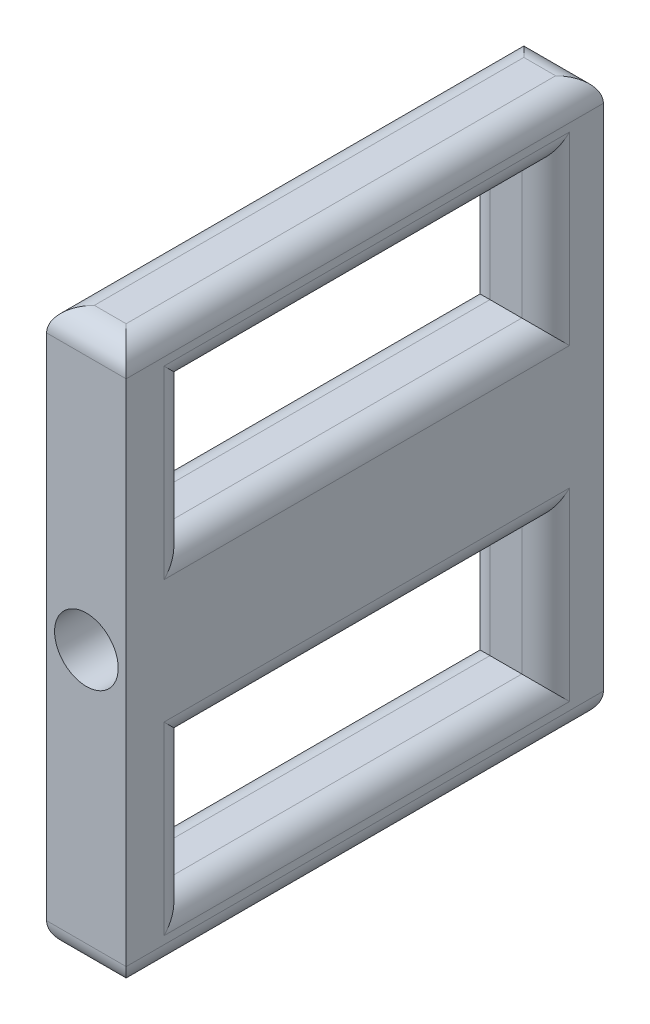
ISO-10303-21;
HEADER;
FILE_DESCRIPTION(('STEP AP214'),'2;1');
FILE_NAME('part.step','',(''),(''),'','','');
FILE_SCHEMA(('AUTOMOTIVE_DESIGN { 1 0 10303 214 1 1 1 1 }'));
ENDSEC;
DATA;
#1=APPLICATION_CONTEXT('core data for automotive mechanical design processes');
#2=APPLICATION_PROTOCOL_DEFINITION('international standard','automotive_design',2000,#1);
#3=PRODUCT_CONTEXT('',#1,'mechanical');
#4=PRODUCT('Part','Part','',(#3));
#5=PRODUCT_RELATED_PRODUCT_CATEGORY('part','',(#4));
#6=PRODUCT_DEFINITION_FORMATION('','',#4);
#7=PRODUCT_DEFINITION_CONTEXT('part definition',#1,'design');
#8=PRODUCT_DEFINITION('design','',#6,#7);
#9=PRODUCT_DEFINITION_SHAPE('','',#8);
#10=(LENGTH_UNIT() NAMED_UNIT(*) SI_UNIT(.MILLI.,.METRE.));
#11=(NAMED_UNIT(*) PLANE_ANGLE_UNIT() SI_UNIT($,.RADIAN.));
#12=(NAMED_UNIT(*) SI_UNIT($,.STERADIAN.) SOLID_ANGLE_UNIT());
#13=UNCERTAINTY_MEASURE_WITH_UNIT(LENGTH_MEASURE(1.E-05),#10,'distance_accuracy_value','');
#14=(GEOMETRIC_REPRESENTATION_CONTEXT(3) GLOBAL_UNCERTAINTY_ASSIGNED_CONTEXT((#13)) GLOBAL_UNIT_ASSIGNED_CONTEXT((#10,
#11,#12)) REPRESENTATION_CONTEXT('',''));
#15=CARTESIAN_POINT('',(0.,0.,0.));
#16=DIRECTION('',(0.,0.,1.));
#17=DIRECTION('',(1.,0.,0.));
#18=AXIS2_PLACEMENT_3D('',#15,#16,#17);
#19=CARTESIAN_POINT('',(0.,25.4568300567052,60.));
#20=DIRECTION('',(1.,0.,0.));
#21=DIRECTION('',(0.,1.,0.));
#22=AXIS2_PLACEMENT_3D('',#19,#20,#21);
#23=PLANE('',#22);
#24=DIRECTION('',(0.,1.,0.));
#25=VECTOR('',#24,1.);
#26=CARTESIAN_POINT('',(0.,-37.5539282314345,55.2500473128589));
#27=LINE('',#26,#25);
#28=CARTESIAN_POINT('',(0.,-17.2945836921086,55.2500473128589));
#29=VERTEX_POINT('',#28);
#30=CARTESIAN_POINT('',(0.,-40.5539282314345,55.2500473128589));
#31=VERTEX_POINT('',#30);
#32=EDGE_CURVE('E378',#29,#31,#27,.F.);
#33=ORIENTED_EDGE('',*,*,#32,.T.);
#34=DIRECTION('',(0.,0.,-1.));
#35=VECTOR('',#34,1.);
#36=CARTESIAN_POINT('',(0.,-40.5539282314345,60.));
#37=LINE('',#36,#35);
#38=CARTESIAN_POINT('',(0.,-40.5539282314345,4.25773889837708));
#39=VERTEX_POINT('',#38);
#40=EDGE_CURVE('E371',#31,#39,#37,.T.);
#41=ORIENTED_EDGE('',*,*,#40,.T.);
#42=DIRECTION('',(0.,1.,0.));
#43=VECTOR('',#42,1.);
#44=CARTESIAN_POINT('',(0.,25.4568300567052,4.25773889837708));
#45=LINE('',#44,#43);
#46=CARTESIAN_POINT('',(0.,-17.2945836921086,4.25773889837708));
#47=VERTEX_POINT('',#46);
#48=EDGE_CURVE('E374',#39,#47,#45,.T.);
#49=ORIENTED_EDGE('',*,*,#48,.T.);
#50=DIRECTION('',(0.,0.,-1.));
#51=VECTOR('',#50,1.);
#52=CARTESIAN_POINT('',(0.,-17.2945836921086,52.2500473128589));
#53=LINE('',#52,#51);
#54=EDGE_CURVE('E376',#47,#29,#53,.F.);
#55=ORIENTED_EDGE('',*,*,#54,.T.);
#56=EDGE_LOOP('',(#33,#41,#49,#55));
#57=FACE_BOUND('',#56,.T.);
#58=DIRECTION('',(0.,-1.,0.));
#59=VECTOR('',#58,1.);
#60=CARTESIAN_POINT('',(0.,25.4568300567052,55.2500473128589));
#61=LINE('',#60,#59);
#62=CARTESIAN_POINT('',(0.,21.4675883448449,55.2500473128589));
#63=VERTEX_POINT('',#62);
#64=CARTESIAN_POINT('',(0.,-1.79175619448095,55.2500473128589));
#65=VERTEX_POINT('',#64);
#66=EDGE_CURVE('E382',#63,#65,#61,.T.);
#67=ORIENTED_EDGE('',*,*,#66,.T.);
#68=DIRECTION('',(0.,0.,-1.));
#69=VECTOR('',#68,1.);
#70=CARTESIAN_POINT('',(0.,-1.79175619448095,60.));
#71=LINE('',#70,#69);
#72=CARTESIAN_POINT('',(0.,-1.79175619448095,4.25773889837702));
#73=VERTEX_POINT('',#72);
#74=EDGE_CURVE('E380',#65,#73,#71,.T.);
#75=ORIENTED_EDGE('',*,*,#74,.T.);
#76=DIRECTION('',(0.,-1.,0.));
#77=VECTOR('',#76,1.);
#78=CARTESIAN_POINT('',(0.,18.4675883448449,4.25773889837702));
#79=LINE('',#78,#77);
#80=CARTESIAN_POINT('',(0.,21.4675883448449,4.25773889837702));
#81=VERTEX_POINT('',#80);
#82=EDGE_CURVE('E385',#73,#81,#79,.F.);
#83=ORIENTED_EDGE('',*,*,#82,.T.);
#84=DIRECTION('',(0.,0.,-1.));
#85=VECTOR('',#84,1.);
#86=CARTESIAN_POINT('',(0.,21.4675883448449,52.2500473128589));
#87=LINE('',#86,#85);
#88=EDGE_CURVE('E203',#81,#63,#87,.F.);
#89=ORIENTED_EDGE('',*,*,#88,.T.);
#90=EDGE_LOOP('',(#67,#75,#83,#89));
#91=FACE_BOUND('',#90,.T.);
#92=DIRECTION('',(0.,-1.,0.));
#93=VECTOR('',#92,1.);
#94=CARTESIAN_POINT('',(0.,25.4568300567052,60.));
#95=LINE('',#94,#93);
#96=CARTESIAN_POINT('',(0.,22.4568300567052,60.));
#97=VERTEX_POINT('',#96);
#98=CARTESIAN_POINT('',(0.,-41.5431699432948,60.));
#99=VERTEX_POINT('',#98);
#100=EDGE_CURVE('E198',#97,#99,#95,.T.);
#101=ORIENTED_EDGE('',*,*,#100,.F.);
#102=DIRECTION('',(0.,0.,-1.));
#103=VECTOR('',#102,1.);
#104=CARTESIAN_POINT('',(0.,22.4568300567052,60.));
#105=LINE('',#104,#103);
#106=CARTESIAN_POINT('',(0.,22.4568300567052,0.));
#107=VERTEX_POINT('',#106);
#108=EDGE_CURVE('E194',#97,#107,#105,.T.);
#109=ORIENTED_EDGE('',*,*,#108,.T.);
#110=DIRECTION('',(0.,-1.,0.));
#111=VECTOR('',#110,1.);
#112=CARTESIAN_POINT('',(0.,25.4568300567052,0.));
#113=LINE('',#112,#111);
#114=CARTESIAN_POINT('',(0.,-41.5431699432948,0.));
#115=VERTEX_POINT('',#114);
#116=EDGE_CURVE('E196',#107,#115,#113,.T.);
#117=ORIENTED_EDGE('',*,*,#116,.T.);
#118=DIRECTION('',(0.,0.,-1.));
#119=VECTOR('',#118,1.);
#120=CARTESIAN_POINT('',(0.,-41.5431699432948,60.));
#121=LINE('',#120,#119);
#122=EDGE_CURVE('E204',#115,#99,#121,.F.);
#123=ORIENTED_EDGE('',*,*,#122,.T.);
#124=EDGE_LOOP('',(#101,#109,#117,#123));
#125=FACE_BOUND('',#124,.T.);
#126=ADVANCED_FACE('F32',(#57,#91,#125),#23,.F.);
#127=CARTESIAN_POINT('',(10.,25.4568300567052,60.));
#128=DIRECTION('',(-1.,0.,0.));
#129=DIRECTION('',(0.,0.,1.));
#130=AXIS2_PLACEMENT_3D('',#127,#128,#129);
#131=PLANE('',#130);
#132=DIRECTION('',(0.,1.,0.));
#133=VECTOR('',#132,1.);
#134=CARTESIAN_POINT('',(10.,25.4568300567052,4.25773889837708));
#135=LINE('',#134,#133);
#136=CARTESIAN_POINT('',(10.,-17.2945836921086,4.25773889837708));
#137=VERTEX_POINT('',#136);
#138=CARTESIAN_POINT('',(10.,-40.5539282314345,4.25773889837708));
#139=VERTEX_POINT('',#138);
#140=EDGE_CURVE('E346',#137,#139,#135,.F.);
#141=ORIENTED_EDGE('',*,*,#140,.T.);
#142=DIRECTION('',(0.,0.,-1.));
#143=VECTOR('',#142,1.);
#144=CARTESIAN_POINT('',(10.,-40.5539282314345,60.));
#145=LINE('',#144,#143);
#146=CARTESIAN_POINT('',(10.,-40.5539282314345,55.2500473128589));
#147=VERTEX_POINT('',#146);
#148=EDGE_CURVE('E343',#139,#147,#145,.F.);
#149=ORIENTED_EDGE('',*,*,#148,.T.);
#150=DIRECTION('',(0.,1.,0.));
#151=VECTOR('',#150,1.);
#152=CARTESIAN_POINT('',(10.,-20.2945836921086,55.2500473128589));
#153=LINE('',#152,#151);
#154=CARTESIAN_POINT('',(10.,-17.2945836921086,55.2500473128589));
#155=VERTEX_POINT('',#154);
#156=EDGE_CURVE('E350',#147,#155,#153,.T.);
#157=ORIENTED_EDGE('',*,*,#156,.T.);
#158=DIRECTION('',(0.,0.,-1.));
#159=VECTOR('',#158,1.);
#160=CARTESIAN_POINT('',(10.,-17.2945836921086,7.25773889837708));
#161=LINE('',#160,#159);
#162=EDGE_CURVE('E348',#155,#137,#161,.T.);
#163=ORIENTED_EDGE('',*,*,#162,.T.);
#164=EDGE_LOOP('',(#141,#149,#157,#163));
#165=FACE_BOUND('',#164,.T.);
#166=DIRECTION('',(0.,-1.,0.));
#167=VECTOR('',#166,1.);
#168=CARTESIAN_POINT('',(10.,25.4568300567052,55.2500473128589));
#169=LINE('',#168,#167);
#170=CARTESIAN_POINT('',(10.,-1.79175619448095,55.2500473128589));
#171=VERTEX_POINT('',#170);
#172=CARTESIAN_POINT('',(10.,21.4675883448449,55.2500473128589));
#173=VERTEX_POINT('',#172);
#174=EDGE_CURVE('E354',#171,#173,#169,.F.);
#175=ORIENTED_EDGE('',*,*,#174,.T.);
#176=DIRECTION('',(0.,0.,-1.));
#177=VECTOR('',#176,1.);
#178=CARTESIAN_POINT('',(10.,21.4675883448449,7.25773889837703));
#179=LINE('',#178,#177);
#180=CARTESIAN_POINT('',(10.,21.4675883448449,4.25773889837702));
#181=VERTEX_POINT('',#180);
#182=EDGE_CURVE('E352',#173,#181,#179,.T.);
#183=ORIENTED_EDGE('',*,*,#182,.T.);
#184=DIRECTION('',(0.,-1.,0.));
#185=VECTOR('',#184,1.);
#186=CARTESIAN_POINT('',(10.,1.20824380551905,4.25773889837702));
#187=LINE('',#186,#185);
#188=CARTESIAN_POINT('',(10.,-1.79175619448095,4.25773889837702));
#189=VERTEX_POINT('',#188);
#190=EDGE_CURVE('E357',#181,#189,#187,.T.);
#191=ORIENTED_EDGE('',*,*,#190,.T.);
#192=DIRECTION('',(0.,0.,-1.));
#193=VECTOR('',#192,1.);
#194=CARTESIAN_POINT('',(10.,-1.79175619448095,60.));
#195=LINE('',#194,#193);
#196=EDGE_CURVE('E359',#189,#171,#195,.F.);
#197=ORIENTED_EDGE('',*,*,#196,.T.);
#198=EDGE_LOOP('',(#175,#183,#191,#197));
#199=FACE_BOUND('',#198,.T.);
#200=DIRECTION('',(0.,1.,0.));
#201=VECTOR('',#200,1.);
#202=CARTESIAN_POINT('',(10.,25.4568300567052,0.));
#203=LINE('',#202,#201);
#204=CARTESIAN_POINT('',(10.,-41.5431699432948,0.));
#205=VERTEX_POINT('',#204);
#206=CARTESIAN_POINT('',(10.,22.4568300567052,0.));
#207=VERTEX_POINT('',#206);
#208=EDGE_CURVE('E216',#205,#207,#203,.T.);
#209=ORIENTED_EDGE('',*,*,#208,.T.);
#210=DIRECTION('',(0.,0.,-1.));
#211=VECTOR('',#210,1.);
#212=CARTESIAN_POINT('',(10.,22.4568300567052,60.));
#213=LINE('',#212,#211);
#214=CARTESIAN_POINT('',(10.,22.4568300567052,60.));
#215=VERTEX_POINT('',#214);
#216=EDGE_CURVE('E361',#207,#215,#213,.F.);
#217=ORIENTED_EDGE('',*,*,#216,.T.);
#218=DIRECTION('',(0.,1.,0.));
#219=VECTOR('',#218,1.);
#220=CARTESIAN_POINT('',(10.,25.4568300567052,60.));
#221=LINE('',#220,#219);
#222=CARTESIAN_POINT('',(10.,-41.5431699432948,60.));
#223=VERTEX_POINT('',#222);
#224=EDGE_CURVE('E389',#223,#215,#221,.T.);
#225=ORIENTED_EDGE('',*,*,#224,.F.);
#226=DIRECTION('',(0.,0.,-1.));
#227=VECTOR('',#226,1.);
#228=CARTESIAN_POINT('',(10.,-41.5431699432948,60.));
#229=LINE('',#228,#227);
#230=EDGE_CURVE('E363',#223,#205,#229,.T.);
#231=ORIENTED_EDGE('',*,*,#230,.T.);
#232=EDGE_LOOP('',(#209,#217,#225,#231));
#233=FACE_BOUND('',#232,.T.);
#234=ADVANCED_FACE('F480',(#165,#199,#233),#131,.F.);
#235=CARTESIAN_POINT('',(0.,0.,60.));
#236=DIRECTION('',(0.,0.,-1.));
#237=DIRECTION('',(-1.,0.,0.));
#238=AXIS2_PLACEMENT_3D('',#235,#236,#237);
#239=PLANE('',#238);
#240=ORIENTED_EDGE('',*,*,#224,.T.);
#241=DIRECTION('',(-1.,0.,0.));
#242=VECTOR('',#241,1.);
#243=CARTESIAN_POINT('',(0.,22.4568300567052,60.));
#244=LINE('',#243,#242);
#245=EDGE_CURVE('E309',#215,#97,#244,.T.);
#246=ORIENTED_EDGE('',*,*,#245,.T.);
#247=ORIENTED_EDGE('',*,*,#100,.T.);
#248=DIRECTION('',(1.,0.,0.));
#249=VECTOR('',#248,1.);
#250=CARTESIAN_POINT('',(0.,-41.5431699432948,60.));
#251=LINE('',#250,#249);
#252=EDGE_CURVE('E311',#99,#223,#251,.T.);
#253=ORIENTED_EDGE('',*,*,#252,.T.);
#254=EDGE_LOOP('',(#240,#246,#247,#253));
#255=FACE_BOUND('',#254,.T.);
#256=CARTESIAN_POINT('',(5.,-9.54316994329479,60.));
#257=DIRECTION('',(0.,0.,1.));
#258=DIRECTION('',(1.,0.,0.));
#259=AXIS2_PLACEMENT_3D('',#256,#257,#258);
#260=CIRCLE('',#259,4.);
#261=CARTESIAN_POINT('',(9.,-9.54316994329479,60.));
#262=VERTEX_POINT('',#261);
#263=EDGE_CURVE('E217',#262,#262,#260,.T.);
#264=ORIENTED_EDGE('',*,*,#263,.F.);
#265=EDGE_LOOP('',(#264));
#266=FACE_BOUND('',#265,.T.);
#267=ADVANCED_FACE('F486',(#255,#266),#239,.F.);
#268=CARTESIAN_POINT('',(0.,0.,0.));
#269=DIRECTION('',(0.,0.,-1.));
#270=DIRECTION('',(-1.,0.,0.));
#271=AXIS2_PLACEMENT_3D('',#268,#269,#270);
#272=PLANE('',#271);
#273=ORIENTED_EDGE('',*,*,#116,.F.);
#274=DIRECTION('',(-1.,0.,0.));
#275=VECTOR('',#274,1.);
#276=CARTESIAN_POINT('',(10.,22.4568300567052,0.));
#277=LINE('',#276,#275);
#278=EDGE_CURVE('E212',#107,#207,#277,.F.);
#279=ORIENTED_EDGE('',*,*,#278,.T.);
#280=ORIENTED_EDGE('',*,*,#208,.F.);
#281=DIRECTION('',(1.,0.,0.));
#282=VECTOR('',#281,1.);
#283=CARTESIAN_POINT('',(0.,-41.5431699432948,0.));
#284=LINE('',#283,#282);
#285=EDGE_CURVE('E215',#205,#115,#284,.F.);
#286=ORIENTED_EDGE('',*,*,#285,.T.);
#287=EDGE_LOOP('',(#273,#279,#280,#286));
#288=FACE_BOUND('',#287,.T.);
#289=CARTESIAN_POINT('',(5.,-9.54316994329479,0.));
#290=DIRECTION('',(0.,0.,1.));
#291=DIRECTION('',(1.,0.,0.));
#292=AXIS2_PLACEMENT_3D('',#289,#290,#291);
#293=CIRCLE('',#292,4.);
#294=CARTESIAN_POINT('',(9.,-9.54316994329479,0.));
#295=VERTEX_POINT('',#294);
#296=EDGE_CURVE('E394',#295,#295,#293,.T.);
#297=ORIENTED_EDGE('',*,*,#296,.T.);
#298=EDGE_LOOP('',(#297));
#299=FACE_BOUND('',#298,.T.);
#300=ADVANCED_FACE('F209',(#288,#299),#272,.T.);
#301=CARTESIAN_POINT('',(0.,25.4568300567052,60.));
#302=DIRECTION('',(0.,-1.,0.));
#303=DIRECTION('',(0.,0.,-1.));
#304=AXIS2_PLACEMENT_3D('',#301,#302,#303);
#305=PLANE('',#304);
#306=DIRECTION('',(-1.,0.,0.));
#307=VECTOR('',#306,1.);
#308=CARTESIAN_POINT('',(0.,25.4568300567052,57.));
#309=LINE('',#308,#307);
#310=CARTESIAN_POINT('',(3.,25.4568300567052,57.));
#311=VERTEX_POINT('',#310);
#312=CARTESIAN_POINT('',(7.,25.4568300567052,57.));
#313=VERTEX_POINT('',#312);
#314=EDGE_CURVE('E303',#311,#313,#309,.F.);
#315=ORIENTED_EDGE('',*,*,#314,.T.);
#316=DIRECTION('',(0.,0.,-1.));
#317=VECTOR('',#316,1.);
#318=CARTESIAN_POINT('',(7.,25.4568300567052,60.));
#319=LINE('',#318,#317);
#320=CARTESIAN_POINT('',(7.,25.4568300567052,3.));
#321=VERTEX_POINT('',#320);
#322=EDGE_CURVE('E301',#313,#321,#319,.T.);
#323=ORIENTED_EDGE('',*,*,#322,.T.);
#324=DIRECTION('',(-1.,0.,0.));
#325=VECTOR('',#324,1.);
#326=CARTESIAN_POINT('',(0.,25.4568300567052,3.));
#327=LINE('',#326,#325);
#328=CARTESIAN_POINT('',(3.,25.4568300567052,3.));
#329=VERTEX_POINT('',#328);
#330=EDGE_CURVE('E306',#321,#329,#327,.T.);
#331=ORIENTED_EDGE('',*,*,#330,.T.);
#332=DIRECTION('',(0.,0.,-1.));
#333=VECTOR('',#332,1.);
#334=CARTESIAN_POINT('',(3.,25.4568300567052,60.));
#335=LINE('',#334,#333);
#336=EDGE_CURVE('E232',#329,#311,#335,.F.);
#337=ORIENTED_EDGE('',*,*,#336,.T.);
#338=EDGE_LOOP('',(#315,#323,#331,#337));
#339=FACE_BOUND('',#338,.T.);
#340=ADVANCED_FACE('F493',(#339),#305,.F.);
#341=CARTESIAN_POINT('',(10.,-44.5431699432948,60.));
#342=DIRECTION('',(0.,1.,0.));
#343=DIRECTION('',(0.,0.,1.));
#344=AXIS2_PLACEMENT_3D('',#341,#342,#343);
#345=PLANE('',#344);
#346=DIRECTION('',(1.,0.,0.));
#347=VECTOR('',#346,1.);
#348=CARTESIAN_POINT('',(10.,-44.5431699432948,57.));
#349=LINE('',#348,#347);
#350=CARTESIAN_POINT('',(7.,-44.5431699432948,57.));
#351=VERTEX_POINT('',#350);
#352=CARTESIAN_POINT('',(3.,-44.5431699432948,57.));
#353=VERTEX_POINT('',#352);
#354=EDGE_CURVE('E52',#351,#353,#349,.F.);
#355=ORIENTED_EDGE('',*,*,#354,.T.);
#356=DIRECTION('',(0.,0.,-1.));
#357=VECTOR('',#356,1.);
#358=CARTESIAN_POINT('',(3.,-44.5431699432948,60.));
#359=LINE('',#358,#357);
#360=CARTESIAN_POINT('',(3.,-44.5431699432948,3.));
#361=VERTEX_POINT('',#360);
#362=EDGE_CURVE('E11',#353,#361,#359,.T.);
#363=ORIENTED_EDGE('',*,*,#362,.T.);
#364=DIRECTION('',(1.,0.,0.));
#365=VECTOR('',#364,1.);
#366=CARTESIAN_POINT('',(10.,-44.5431699432948,3.));
#367=LINE('',#366,#365);
#368=CARTESIAN_POINT('',(7.,-44.5431699432948,3.));
#369=VERTEX_POINT('',#368);
#370=EDGE_CURVE('E41',#361,#369,#367,.T.);
#371=ORIENTED_EDGE('',*,*,#370,.T.);
#372=DIRECTION('',(0.,0.,-1.));
#373=VECTOR('',#372,1.);
#374=CARTESIAN_POINT('',(7.,-44.5431699432948,60.));
#375=LINE('',#374,#373);
#376=EDGE_CURVE('E229',#369,#351,#375,.F.);
#377=ORIENTED_EDGE('',*,*,#376,.T.);
#378=EDGE_LOOP('',(#355,#363,#371,#377));
#379=FACE_BOUND('',#378,.T.);
#380=ADVANCED_FACE('F492',(#379),#345,.F.);
#381=CARTESIAN_POINT('',(5.,-9.54316994329479,60.));
#382=DIRECTION('',(0.,0.,-1.));
#383=DIRECTION('',(-1.,0.,0.));
#384=AXIS2_PLACEMENT_3D('',#381,#382,#383);
#385=CYLINDRICAL_SURFACE('',#384,4.);
#386=ORIENTED_EDGE('',*,*,#263,.T.);
#387=EDGE_LOOP('',(#386));
#388=FACE_BOUND('',#387,.T.);
#389=ORIENTED_EDGE('',*,*,#296,.F.);
#390=EDGE_LOOP('',(#389));
#391=FACE_BOUND('',#390,.T.);
#392=ADVANCED_FACE('F585',(#388,#391),#385,.F.);
#393=CARTESIAN_POINT('',(0.,0.,52.2500473128589));
#394=DIRECTION('',(0.,0.,-1.));
#395=DIRECTION('',(-1.,0.,0.));
#396=AXIS2_PLACEMENT_3D('',#393,#394,#395);
#397=PLANE('',#396);
#398=DIRECTION('',(1.,0.,0.));
#399=VECTOR('',#398,1.);
#400=CARTESIAN_POINT('',(0.,-20.2945836921086,52.2500473128589));
#401=LINE('',#400,#399);
#402=CARTESIAN_POINT('',(3.,-20.2945836921086,52.2500473128589));
#403=VERTEX_POINT('',#402);
#404=CARTESIAN_POINT('',(7.,-20.2945836921086,52.2500473128589));
#405=VERTEX_POINT('',#404);
#406=EDGE_CURVE('E397',#403,#405,#401,.T.);
#407=ORIENTED_EDGE('',*,*,#406,.T.);
#408=DIRECTION('',(0.,1.,0.));
#409=VECTOR('',#408,1.);
#410=CARTESIAN_POINT('',(7.,-37.5539282314345,52.2500473128589));
#411=LINE('',#410,#409);
#412=CARTESIAN_POINT('',(7.,-37.5539282314345,52.2500473128589));
#413=VERTEX_POINT('',#412);
#414=EDGE_CURVE('E331',#405,#413,#411,.F.);
#415=ORIENTED_EDGE('',*,*,#414,.T.);
#416=DIRECTION('',(1.,0.,0.));
#417=VECTOR('',#416,1.);
#418=CARTESIAN_POINT('',(0.,-37.5539282314345,52.2500473128589));
#419=LINE('',#418,#417);
#420=CARTESIAN_POINT('',(3.,-37.5539282314345,52.2500473128589));
#421=VERTEX_POINT('',#420);
#422=EDGE_CURVE('E400',#421,#413,#419,.T.);
#423=ORIENTED_EDGE('',*,*,#422,.F.);
#424=DIRECTION('',(0.,1.,0.));
#425=VECTOR('',#424,1.);
#426=CARTESIAN_POINT('',(3.,-20.2945836921086,52.2500473128589));
#427=LINE('',#426,#425);
#428=EDGE_CURVE('E333',#421,#403,#427,.T.);
#429=ORIENTED_EDGE('',*,*,#428,.T.);
#430=EDGE_LOOP('',(#407,#415,#423,#429));
#431=FACE_BOUND('',#430,.T.);
#432=ADVANCED_FACE('F588',(#431),#397,.T.);
#433=CARTESIAN_POINT('',(0.,-20.2945836921086,0.));
#434=DIRECTION('',(0.,-1.,0.));
#435=DIRECTION('',(0.,0.,-1.));
#436=AXIS2_PLACEMENT_3D('',#433,#434,#435);
#437=PLANE('',#436);
#438=ORIENTED_EDGE('',*,*,#406,.F.);
#439=DIRECTION('',(0.,0.,-1.));
#440=VECTOR('',#439,1.);
#441=CARTESIAN_POINT('',(3.,-20.2945836921086,7.25773889837708));
#442=LINE('',#441,#440);
#443=CARTESIAN_POINT('',(3.,-20.2945836921086,7.25773889837708));
#444=VERTEX_POINT('',#443);
#445=EDGE_CURVE('E335',#403,#444,#442,.T.);
#446=ORIENTED_EDGE('',*,*,#445,.T.);
#447=DIRECTION('',(1.,0.,0.));
#448=VECTOR('',#447,1.);
#449=CARTESIAN_POINT('',(0.,-20.2945836921086,7.25773889837708));
#450=LINE('',#449,#448);
#451=CARTESIAN_POINT('',(7.,-20.2945836921086,7.25773889837708));
#452=VERTEX_POINT('',#451);
#453=EDGE_CURVE('E407',#444,#452,#450,.T.);
#454=ORIENTED_EDGE('',*,*,#453,.T.);
#455=DIRECTION('',(0.,0.,-1.));
#456=VECTOR('',#455,1.);
#457=CARTESIAN_POINT('',(7.,-20.2945836921086,52.2500473128589));
#458=LINE('',#457,#456);
#459=EDGE_CURVE('E337',#452,#405,#458,.F.);
#460=ORIENTED_EDGE('',*,*,#459,.T.);
#461=EDGE_LOOP('',(#438,#446,#454,#460));
#462=FACE_BOUND('',#461,.T.);
#463=ADVANCED_FACE('F598',(#462),#437,.T.);
#464=CARTESIAN_POINT('',(0.,0.,7.25773889837708));
#465=DIRECTION('',(0.,0.,-1.));
#466=DIRECTION('',(-1.,0.,0.));
#467=AXIS2_PLACEMENT_3D('',#464,#465,#466);
#468=PLANE('',#467);
#469=ORIENTED_EDGE('',*,*,#453,.F.);
#470=DIRECTION('',(0.,1.,0.));
#471=VECTOR('',#470,1.);
#472=CARTESIAN_POINT('',(3.,0.,7.25773889837708));
#473=LINE('',#472,#471);
#474=CARTESIAN_POINT('',(3.,-37.5539282314345,7.25773889837708));
#475=VERTEX_POINT('',#474);
#476=EDGE_CURVE('E339',#444,#475,#473,.F.);
#477=ORIENTED_EDGE('',*,*,#476,.T.);
#478=DIRECTION('',(1.,0.,0.));
#479=VECTOR('',#478,1.);
#480=CARTESIAN_POINT('',(0.,-37.5539282314345,7.25773889837708));
#481=LINE('',#480,#479);
#482=CARTESIAN_POINT('',(7.,-37.5539282314345,7.25773889837708));
#483=VERTEX_POINT('',#482);
#484=EDGE_CURVE('E403',#475,#483,#481,.T.);
#485=ORIENTED_EDGE('',*,*,#484,.T.);
#486=DIRECTION('',(0.,1.,0.));
#487=VECTOR('',#486,1.);
#488=CARTESIAN_POINT('',(7.,0.,7.25773889837708));
#489=LINE('',#488,#487);
#490=EDGE_CURVE('E341',#483,#452,#489,.T.);
#491=ORIENTED_EDGE('',*,*,#490,.T.);
#492=EDGE_LOOP('',(#469,#477,#485,#491));
#493=FACE_BOUND('',#492,.T.);
#494=ADVANCED_FACE('F602',(#493),#468,.F.);
#495=CARTESIAN_POINT('',(0.,-37.5539282314345,0.));
#496=DIRECTION('',(0.,-1.,0.));
#497=DIRECTION('',(0.,0.,-1.));
#498=AXIS2_PLACEMENT_3D('',#495,#496,#497);
#499=PLANE('',#498);
#500=ORIENTED_EDGE('',*,*,#484,.F.);
#501=DIRECTION('',(0.,0.,-1.));
#502=VECTOR('',#501,1.);
#503=CARTESIAN_POINT('',(3.,-37.5539282314345,0.));
#504=LINE('',#503,#502);
#505=EDGE_CURVE('E365',#475,#421,#504,.F.);
#506=ORIENTED_EDGE('',*,*,#505,.T.);
#507=ORIENTED_EDGE('',*,*,#422,.T.);
#508=DIRECTION('',(0.,0.,-1.));
#509=VECTOR('',#508,1.);
#510=CARTESIAN_POINT('',(7.,-37.5539282314345,0.));
#511=LINE('',#510,#509);
#512=EDGE_CURVE('E368',#413,#483,#511,.T.);
#513=ORIENTED_EDGE('',*,*,#512,.T.);
#514=EDGE_LOOP('',(#500,#506,#507,#513));
#515=FACE_BOUND('',#514,.T.);
#516=ADVANCED_FACE('F477',(#515),#499,.F.);
#517=CARTESIAN_POINT('',(0.,18.4675883448449,52.2500473128589));
#518=DIRECTION('',(0.,-1.,0.));
#519=DIRECTION('',(0.,0.,-1.));
#520=AXIS2_PLACEMENT_3D('',#517,#518,#519);
#521=PLANE('',#520);
#522=DIRECTION('',(1.,0.,0.));
#523=VECTOR('',#522,1.);
#524=CARTESIAN_POINT('',(0.,18.4675883448449,52.2500473128589));
#525=LINE('',#524,#523);
#526=CARTESIAN_POINT('',(3.,18.4675883448449,52.2500473128589));
#527=VERTEX_POINT('',#526);
#528=CARTESIAN_POINT('',(7.,18.4675883448449,52.2500473128589));
#529=VERTEX_POINT('',#528);
#530=EDGE_CURVE('E404',#527,#529,#525,.T.);
#531=ORIENTED_EDGE('',*,*,#530,.F.);
#532=DIRECTION('',(0.,0.,-1.));
#533=VECTOR('',#532,1.);
#534=CARTESIAN_POINT('',(3.,18.4675883448449,7.25773889837703));
#535=LINE('',#534,#533);
#536=CARTESIAN_POINT('',(3.,18.4675883448449,7.25773889837702));
#537=VERTEX_POINT('',#536);
#538=EDGE_CURVE('E313',#527,#537,#535,.T.);
#539=ORIENTED_EDGE('',*,*,#538,.T.);
#540=DIRECTION('',(1.,0.,0.));
#541=VECTOR('',#540,1.);
#542=CARTESIAN_POINT('',(0.,18.4675883448449,7.25773889837702));
#543=LINE('',#542,#541);
#544=CARTESIAN_POINT('',(7.,18.4675883448449,7.25773889837702));
#545=VERTEX_POINT('',#544);
#546=EDGE_CURVE('E290',#537,#545,#543,.T.);
#547=ORIENTED_EDGE('',*,*,#546,.T.);
#548=DIRECTION('',(0.,0.,-1.));
#549=VECTOR('',#548,1.);
#550=CARTESIAN_POINT('',(7.,18.4675883448449,52.2500473128589));
#551=LINE('',#550,#549);
#552=EDGE_CURVE('E315',#545,#529,#551,.F.);
#553=ORIENTED_EDGE('',*,*,#552,.T.);
#554=EDGE_LOOP('',(#531,#539,#547,#553));
#555=FACE_BOUND('',#554,.T.);
#556=ADVANCED_FACE('F425',(#555),#521,.T.);
#557=CARTESIAN_POINT('',(0.,18.4675883448449,7.25773889837702));
#558=DIRECTION('',(0.,0.,1.));
#559=DIRECTION('',(1.,0.,0.));
#560=AXIS2_PLACEMENT_3D('',#557,#558,#559);
#561=PLANE('',#560);
#562=ORIENTED_EDGE('',*,*,#546,.F.);
#563=DIRECTION('',(0.,-1.,0.));
#564=VECTOR('',#563,1.);
#565=CARTESIAN_POINT('',(3.,1.20824380551905,7.25773889837702));
#566=LINE('',#565,#564);
#567=CARTESIAN_POINT('',(3.,1.20824380551905,7.25773889837702));
#568=VERTEX_POINT('',#567);
#569=EDGE_CURVE('E321',#537,#568,#566,.T.);
#570=ORIENTED_EDGE('',*,*,#569,.T.);
#571=DIRECTION('',(1.,0.,0.));
#572=VECTOR('',#571,1.);
#573=CARTESIAN_POINT('',(0.,1.20824380551905,7.25773889837702));
#574=LINE('',#573,#572);
#575=CARTESIAN_POINT('',(7.,1.20824380551905,7.25773889837702));
#576=VERTEX_POINT('',#575);
#577=EDGE_CURVE('E417',#568,#576,#574,.T.);
#578=ORIENTED_EDGE('',*,*,#577,.T.);
#579=DIRECTION('',(0.,-1.,0.));
#580=VECTOR('',#579,1.);
#581=CARTESIAN_POINT('',(7.,18.4675883448449,7.25773889837702));
#582=LINE('',#581,#580);
#583=EDGE_CURVE('E323',#576,#545,#582,.F.);
#584=ORIENTED_EDGE('',*,*,#583,.T.);
#585=EDGE_LOOP('',(#562,#570,#578,#584));
#586=FACE_BOUND('',#585,.T.);
#587=ADVANCED_FACE('F469',(#586),#561,.T.);
#588=CARTESIAN_POINT('',(0.,1.20824380551905,52.2500473128589));
#589=DIRECTION('',(0.,-1.,0.));
#590=DIRECTION('',(0.,0.,-1.));
#591=AXIS2_PLACEMENT_3D('',#588,#589,#590);
#592=PLANE('',#591);
#593=ORIENTED_EDGE('',*,*,#577,.F.);
#594=DIRECTION('',(0.,0.,-1.));
#595=VECTOR('',#594,1.);
#596=CARTESIAN_POINT('',(3.,1.20824380551905,52.2500473128589));
#597=LINE('',#596,#595);
#598=CARTESIAN_POINT('',(3.,1.20824380551905,52.2500473128589));
#599=VERTEX_POINT('',#598);
#600=EDGE_CURVE('E317',#568,#599,#597,.F.);
#601=ORIENTED_EDGE('',*,*,#600,.T.);
#602=DIRECTION('',(1.,0.,0.));
#603=VECTOR('',#602,1.);
#604=CARTESIAN_POINT('',(0.,1.20824380551905,52.2500473128589));
#605=LINE('',#604,#603);
#606=CARTESIAN_POINT('',(7.,1.20824380551905,52.2500473128589));
#607=VERTEX_POINT('',#606);
#608=EDGE_CURVE('E414',#599,#607,#605,.T.);
#609=ORIENTED_EDGE('',*,*,#608,.T.);
#610=DIRECTION('',(0.,0.,-1.));
#611=VECTOR('',#610,1.);
#612=CARTESIAN_POINT('',(7.,1.20824380551905,52.2500473128589));
#613=LINE('',#612,#611);
#614=EDGE_CURVE('E319',#607,#576,#613,.T.);
#615=ORIENTED_EDGE('',*,*,#614,.T.);
#616=EDGE_LOOP('',(#593,#601,#609,#615));
#617=FACE_BOUND('',#616,.T.);
#618=ADVANCED_FACE('F451',(#617),#592,.F.);
#619=CARTESIAN_POINT('',(0.,18.4675883448449,52.2500473128589));
#620=DIRECTION('',(0.,0.,1.));
#621=DIRECTION('',(1.,0.,0.));
#622=AXIS2_PLACEMENT_3D('',#619,#620,#621);
#623=PLANE('',#622);
#624=ORIENTED_EDGE('',*,*,#608,.F.);
#625=DIRECTION('',(0.,-1.,0.));
#626=VECTOR('',#625,1.);
#627=CARTESIAN_POINT('',(3.,18.4675883448449,52.2500473128589));
#628=LINE('',#627,#626);
#629=EDGE_CURVE('E325',#599,#527,#628,.F.);
#630=ORIENTED_EDGE('',*,*,#629,.T.);
#631=ORIENTED_EDGE('',*,*,#530,.T.);
#632=DIRECTION('',(0.,-1.,0.));
#633=VECTOR('',#632,1.);
#634=CARTESIAN_POINT('',(7.,18.4675883448449,52.2500473128589));
#635=LINE('',#634,#633);
#636=EDGE_CURVE('E328',#529,#607,#635,.T.);
#637=ORIENTED_EDGE('',*,*,#636,.T.);
#638=EDGE_LOOP('',(#624,#630,#631,#637));
#639=FACE_BOUND('',#638,.T.);
#640=ADVANCED_FACE('F447',(#639),#623,.F.);
#641=CARTESIAN_POINT('',(3.,-17.2945836921086,0.));
#642=DIRECTION('',(0.,0.,1.));
#643=DIRECTION('',(1.,0.,0.));
#644=AXIS2_PLACEMENT_3D('',#641,#642,#643);
#645=CYLINDRICAL_SURFACE('',#644,3.);
#646=CARTESIAN_POINT('',(3.,-17.2945836921086,4.25773889837708));
#647=DIRECTION('',(0.,0.707106781186547,0.707106781186547));
#648=DIRECTION('',(0.,0.707106781186547,-0.707106781186547));
#649=AXIS2_PLACEMENT_3D('',#646,#647,#648);
#650=ELLIPSE('',#649,4.24264068711928,3.);
#651=EDGE_CURVE('E291',#444,#47,#650,.F.);
#652=ORIENTED_EDGE('',*,*,#651,.F.);
#653=ORIENTED_EDGE('',*,*,#445,.F.);
#654=CARTESIAN_POINT('',(3.,-17.2945836921086,55.2500473128589));
#655=DIRECTION('',(0.,-0.707106781186547,0.707106781186547));
#656=DIRECTION('',(0.,0.707106781186547,0.707106781186547));
#657=AXIS2_PLACEMENT_3D('',#654,#655,#656);
#658=ELLIPSE('',#657,4.24264068711928,3.);
#659=EDGE_CURVE('E287',#29,#403,#658,.T.);
#660=ORIENTED_EDGE('',*,*,#659,.F.);
#661=ORIENTED_EDGE('',*,*,#54,.F.);
#662=EDGE_LOOP('',(#652,#653,#660,#661));
#663=FACE_BOUND('',#662,.T.);
#664=ADVANCED_FACE('F509',(#663),#645,.T.);
#665=CARTESIAN_POINT('',(3.,0.,55.2500473128589));
#666=DIRECTION('',(0.,-1.,0.));
#667=DIRECTION('',(1.,0.,0.));
#668=AXIS2_PLACEMENT_3D('',#665,#666,#667);
#669=CYLINDRICAL_SURFACE('',#668,3.);
#670=ORIENTED_EDGE('',*,*,#659,.T.);
#671=ORIENTED_EDGE('',*,*,#428,.F.);
#672=CARTESIAN_POINT('',(3.,-40.5539282314345,55.2500473128589));
#673=DIRECTION('',(0.,-0.707106781186547,-0.707106781186547));
#674=DIRECTION('',(0.,0.707106781186547,-0.707106781186547));
#675=AXIS2_PLACEMENT_3D('',#672,#673,#674);
#676=ELLIPSE('',#675,4.24264068711928,3.);
#677=EDGE_CURVE('E294',#31,#421,#676,.T.);
#678=ORIENTED_EDGE('',*,*,#677,.F.);
#679=ORIENTED_EDGE('',*,*,#32,.F.);
#680=EDGE_LOOP('',(#670,#671,#678,#679));
#681=FACE_BOUND('',#680,.T.);
#682=ADVANCED_FACE('F505',(#681),#669,.T.);
#683=CARTESIAN_POINT('',(3.,25.4568300567052,4.25773889837708));
#684=DIRECTION('',(0.,1.,0.));
#685=DIRECTION('',(-1.,0.,0.));
#686=AXIS2_PLACEMENT_3D('',#683,#684,#685);
#687=CYLINDRICAL_SURFACE('',#686,3.);
#688=ORIENTED_EDGE('',*,*,#651,.T.);
#689=ORIENTED_EDGE('',*,*,#48,.F.);
#690=CARTESIAN_POINT('',(3.,-40.5539282314345,4.25773889837708));
#691=DIRECTION('',(0.,0.707106781186547,-0.707106781186547));
#692=DIRECTION('',(0.,-0.707106781186547,-0.707106781186547));
#693=AXIS2_PLACEMENT_3D('',#690,#691,#692);
#694=ELLIPSE('',#693,4.24264068711928,3.);
#695=EDGE_CURVE('E280',#475,#39,#694,.F.);
#696=ORIENTED_EDGE('',*,*,#695,.F.);
#697=ORIENTED_EDGE('',*,*,#476,.F.);
#698=EDGE_LOOP('',(#688,#689,#696,#697));
#699=FACE_BOUND('',#698,.T.);
#700=ADVANCED_FACE('F501',(#699),#687,.T.);
#701=CARTESIAN_POINT('',(3.,-40.5539282314345,60.));
#702=DIRECTION('',(0.,0.,-1.));
#703=DIRECTION('',(-1.,0.,0.));
#704=AXIS2_PLACEMENT_3D('',#701,#702,#703);
#705=CYLINDRICAL_SURFACE('',#704,3.);
#706=ORIENTED_EDGE('',*,*,#677,.T.);
#707=ORIENTED_EDGE('',*,*,#505,.F.);
#708=ORIENTED_EDGE('',*,*,#695,.T.);
#709=ORIENTED_EDGE('',*,*,#40,.F.);
#710=EDGE_LOOP('',(#706,#707,#708,#709));
#711=FACE_BOUND('',#710,.T.);
#712=ADVANCED_FACE('F497',(#711),#705,.T.);
#713=CARTESIAN_POINT('',(7.,-17.2945836921086,60.));
#714=DIRECTION('',(0.,0.,1.));
#715=DIRECTION('',(1.,0.,0.));
#716=AXIS2_PLACEMENT_3D('',#713,#714,#715);
#717=CYLINDRICAL_SURFACE('',#716,3.);
#718=CARTESIAN_POINT('',(7.,-17.2945836921086,4.25773889837708));
#719=DIRECTION('',(0.,0.707106781186547,0.707106781186547));
#720=DIRECTION('',(0.,0.707106781186547,-0.707106781186547));
#721=AXIS2_PLACEMENT_3D('',#718,#719,#720);
#722=ELLIPSE('',#721,4.24264068711928,3.);
#723=EDGE_CURVE('E281',#137,#452,#722,.F.);
#724=ORIENTED_EDGE('',*,*,#723,.F.);
#725=ORIENTED_EDGE('',*,*,#162,.F.);
#726=CARTESIAN_POINT('',(7.,-17.2945836921086,55.2500473128589));
#727=DIRECTION('',(0.,-0.707106781186547,0.707106781186547));
#728=DIRECTION('',(0.,0.707106781186547,0.707106781186547));
#729=AXIS2_PLACEMENT_3D('',#726,#727,#728);
#730=ELLIPSE('',#729,4.24264068711928,3.);
#731=EDGE_CURVE('E277',#405,#155,#730,.T.);
#732=ORIENTED_EDGE('',*,*,#731,.F.);
#733=ORIENTED_EDGE('',*,*,#459,.F.);
#734=EDGE_LOOP('',(#724,#725,#732,#733));
#735=FACE_BOUND('',#734,.T.);
#736=ADVANCED_FACE('F500',(#735),#717,.T.);
#737=CARTESIAN_POINT('',(7.,25.4568300567052,55.2500473128589));
#738=DIRECTION('',(0.,-1.,0.));
#739=DIRECTION('',(0.,0.,-1.));
#740=AXIS2_PLACEMENT_3D('',#737,#738,#739);
#741=CYLINDRICAL_SURFACE('',#740,3.);
#742=ORIENTED_EDGE('',*,*,#731,.T.);
#743=ORIENTED_EDGE('',*,*,#156,.F.);
#744=CARTESIAN_POINT('',(7.,-40.5539282314345,55.2500473128589));
#745=DIRECTION('',(0.,-0.707106781186547,-0.707106781186547));
#746=DIRECTION('',(0.,0.707106781186547,-0.707106781186547));
#747=AXIS2_PLACEMENT_3D('',#744,#745,#746);
#748=ELLIPSE('',#747,4.24264068711928,3.);
#749=EDGE_CURVE('E284',#413,#147,#748,.T.);
#750=ORIENTED_EDGE('',*,*,#749,.F.);
#751=ORIENTED_EDGE('',*,*,#414,.F.);
#752=EDGE_LOOP('',(#742,#743,#750,#751));
#753=FACE_BOUND('',#752,.T.);
#754=ADVANCED_FACE('F521',(#753),#741,.T.);
#755=CARTESIAN_POINT('',(7.,0.,4.25773889837708));
#756=DIRECTION('',(0.,1.,0.));
#757=DIRECTION('',(0.,0.,1.));
#758=AXIS2_PLACEMENT_3D('',#755,#756,#757);
#759=CYLINDRICAL_SURFACE('',#758,3.);
#760=ORIENTED_EDGE('',*,*,#723,.T.);
#761=ORIENTED_EDGE('',*,*,#490,.F.);
#762=CARTESIAN_POINT('',(7.,-40.5539282314345,4.25773889837708));
#763=DIRECTION('',(0.,0.707106781186547,-0.707106781186547));
#764=DIRECTION('',(0.,-0.707106781186547,-0.707106781186547));
#765=AXIS2_PLACEMENT_3D('',#762,#763,#764);
#766=ELLIPSE('',#765,4.24264068711928,3.);
#767=EDGE_CURVE('E270',#139,#483,#766,.F.);
#768=ORIENTED_EDGE('',*,*,#767,.F.);
#769=ORIENTED_EDGE('',*,*,#140,.F.);
#770=EDGE_LOOP('',(#760,#761,#768,#769));
#771=FACE_BOUND('',#770,.T.);
#772=ADVANCED_FACE('F517',(#771),#759,.T.);
#773=CARTESIAN_POINT('',(7.,-40.5539282314345,0.));
#774=DIRECTION('',(0.,0.,-1.));
#775=DIRECTION('',(-1.,0.,0.));
#776=AXIS2_PLACEMENT_3D('',#773,#774,#775);
#777=CYLINDRICAL_SURFACE('',#776,3.);
#778=ORIENTED_EDGE('',*,*,#749,.T.);
#779=ORIENTED_EDGE('',*,*,#148,.F.);
#780=ORIENTED_EDGE('',*,*,#767,.T.);
#781=ORIENTED_EDGE('',*,*,#512,.F.);
#782=EDGE_LOOP('',(#778,#779,#780,#781));
#783=FACE_BOUND('',#782,.T.);
#784=ADVANCED_FACE('F514',(#783),#777,.T.);
#785=CARTESIAN_POINT('',(3.,18.4675883448449,4.25773889837702));
#786=DIRECTION('',(0.,1.,0.));
#787=DIRECTION('',(-1.,0.,0.));
#788=AXIS2_PLACEMENT_3D('',#785,#786,#787);
#789=CYLINDRICAL_SURFACE('',#788,3.);
#790=CARTESIAN_POINT('',(3.,-1.79175619448095,4.25773889837702));
#791=DIRECTION('',(0.,0.707106781186547,-0.707106781186547));
#792=DIRECTION('',(0.,0.707106781186547,0.707106781186547));
#793=AXIS2_PLACEMENT_3D('',#790,#791,#792);
#794=ELLIPSE('',#793,4.24264068711928,3.);
#795=EDGE_CURVE('E271',#568,#73,#794,.F.);
#796=ORIENTED_EDGE('',*,*,#795,.F.);
#797=ORIENTED_EDGE('',*,*,#569,.F.);
#798=CARTESIAN_POINT('',(3.,21.4675883448449,4.25773889837702));
#799=DIRECTION('',(0.,0.707106781186547,0.707106781186547));
#800=DIRECTION('',(0.,0.707106781186547,-0.707106781186547));
#801=AXIS2_PLACEMENT_3D('',#798,#799,#800);
#802=ELLIPSE('',#801,4.24264068711928,3.);
#803=EDGE_CURVE('E267',#81,#537,#802,.T.);
#804=ORIENTED_EDGE('',*,*,#803,.F.);
#805=ORIENTED_EDGE('',*,*,#82,.F.);
#806=EDGE_LOOP('',(#796,#797,#804,#805));
#807=FACE_BOUND('',#806,.T.);
#808=ADVANCED_FACE('F468',(#807),#789,.T.);
#809=CARTESIAN_POINT('',(3.,21.4675883448449,52.2500473128589));
#810=DIRECTION('',(0.,0.,1.));
#811=DIRECTION('',(1.,0.,0.));
#812=AXIS2_PLACEMENT_3D('',#809,#810,#811);
#813=CYLINDRICAL_SURFACE('',#812,3.);
#814=ORIENTED_EDGE('',*,*,#803,.T.);
#815=ORIENTED_EDGE('',*,*,#538,.F.);
#816=CARTESIAN_POINT('',(3.,21.4675883448449,55.2500473128589));
#817=DIRECTION('',(0.,-0.707106781186547,0.707106781186547));
#818=DIRECTION('',(0.,-0.707106781186547,-0.707106781186547));
#819=AXIS2_PLACEMENT_3D('',#816,#817,#818);
#820=ELLIPSE('',#819,4.24264068711928,3.);
#821=EDGE_CURVE('E274',#63,#527,#820,.T.);
#822=ORIENTED_EDGE('',*,*,#821,.F.);
#823=ORIENTED_EDGE('',*,*,#88,.F.);
#824=EDGE_LOOP('',(#814,#815,#822,#823));
#825=FACE_BOUND('',#824,.T.);
#826=ADVANCED_FACE('F464',(#825),#813,.T.);
#827=CARTESIAN_POINT('',(3.,-1.79175619448095,60.));
#828=DIRECTION('',(0.,0.,-1.));
#829=DIRECTION('',(-1.,0.,0.));
#830=AXIS2_PLACEMENT_3D('',#827,#828,#829);
#831=CYLINDRICAL_SURFACE('',#830,3.);
#832=ORIENTED_EDGE('',*,*,#795,.T.);
#833=ORIENTED_EDGE('',*,*,#74,.F.);
#834=CARTESIAN_POINT('',(3.,-1.79175619448095,55.2500473128589));
#835=DIRECTION('',(0.,-0.707106781186547,-0.707106781186547));
#836=DIRECTION('',(0.,-0.707106781186547,0.707106781186547));
#837=AXIS2_PLACEMENT_3D('',#834,#835,#836);
#838=ELLIPSE('',#837,4.24264068711928,3.);
#839=EDGE_CURVE('E260',#599,#65,#838,.F.);
#840=ORIENTED_EDGE('',*,*,#839,.F.);
#841=ORIENTED_EDGE('',*,*,#600,.F.);
#842=EDGE_LOOP('',(#832,#833,#840,#841));
#843=FACE_BOUND('',#842,.T.);
#844=ADVANCED_FACE('F456',(#843),#831,.T.);
#845=CARTESIAN_POINT('',(3.,25.4568300567052,55.2500473128589));
#846=DIRECTION('',(0.,-1.,0.));
#847=DIRECTION('',(1.,0.,0.));
#848=AXIS2_PLACEMENT_3D('',#845,#846,#847);
#849=CYLINDRICAL_SURFACE('',#848,3.);
#850=ORIENTED_EDGE('',*,*,#821,.T.);
#851=ORIENTED_EDGE('',*,*,#629,.F.);
#852=ORIENTED_EDGE('',*,*,#839,.T.);
#853=ORIENTED_EDGE('',*,*,#66,.F.);
#854=EDGE_LOOP('',(#850,#851,#852,#853));
#855=FACE_BOUND('',#854,.T.);
#856=ADVANCED_FACE('F460',(#855),#849,.T.);
#857=CARTESIAN_POINT('',(7.,25.4568300567052,4.25773889837702));
#858=DIRECTION('',(0.,1.,0.));
#859=DIRECTION('',(0.,0.,1.));
#860=AXIS2_PLACEMENT_3D('',#857,#858,#859);
#861=CYLINDRICAL_SURFACE('',#860,3.);
#862=CARTESIAN_POINT('',(7.,-1.79175619448095,4.25773889837702));
#863=DIRECTION('',(0.,0.707106781186547,-0.707106781186547));
#864=DIRECTION('',(0.,0.707106781186547,0.707106781186547));
#865=AXIS2_PLACEMENT_3D('',#862,#863,#864);
#866=ELLIPSE('',#865,4.24264068711928,3.);
#867=EDGE_CURVE('E261',#189,#576,#866,.F.);
#868=ORIENTED_EDGE('',*,*,#867,.F.);
#869=ORIENTED_EDGE('',*,*,#190,.F.);
#870=CARTESIAN_POINT('',(7.,21.4675883448449,4.25773889837702));
#871=DIRECTION('',(0.,0.707106781186547,0.707106781186547));
#872=DIRECTION('',(0.,0.707106781186547,-0.707106781186547));
#873=AXIS2_PLACEMENT_3D('',#870,#871,#872);
#874=ELLIPSE('',#873,4.24264068711928,3.);
#875=EDGE_CURVE('E257',#545,#181,#874,.T.);
#876=ORIENTED_EDGE('',*,*,#875,.F.);
#877=ORIENTED_EDGE('',*,*,#583,.F.);
#878=EDGE_LOOP('',(#868,#869,#876,#877));
#879=FACE_BOUND('',#878,.T.);
#880=ADVANCED_FACE('F434',(#879),#861,.T.);
#881=CARTESIAN_POINT('',(7.,21.4675883448449,60.));
#882=DIRECTION('',(0.,0.,1.));
#883=DIRECTION('',(1.,0.,0.));
#884=AXIS2_PLACEMENT_3D('',#881,#882,#883);
#885=CYLINDRICAL_SURFACE('',#884,3.);
#886=ORIENTED_EDGE('',*,*,#875,.T.);
#887=ORIENTED_EDGE('',*,*,#182,.F.);
#888=CARTESIAN_POINT('',(7.,21.4675883448449,55.2500473128589));
#889=DIRECTION('',(0.,-0.707106781186547,0.707106781186547));
#890=DIRECTION('',(0.,-0.707106781186547,-0.707106781186547));
#891=AXIS2_PLACEMENT_3D('',#888,#889,#890);
#892=ELLIPSE('',#891,4.24264068711928,3.);
#893=EDGE_CURVE('E264',#529,#173,#892,.T.);
#894=ORIENTED_EDGE('',*,*,#893,.F.);
#895=ORIENTED_EDGE('',*,*,#552,.F.);
#896=EDGE_LOOP('',(#886,#887,#894,#895));
#897=FACE_BOUND('',#896,.T.);
#898=ADVANCED_FACE('F438',(#897),#885,.T.);
#899=CARTESIAN_POINT('',(7.,-1.79175619448095,52.2500473128589));
#900=DIRECTION('',(0.,0.,-1.));
#901=DIRECTION('',(-1.,0.,0.));
#902=AXIS2_PLACEMENT_3D('',#899,#900,#901);
#903=CYLINDRICAL_SURFACE('',#902,3.);
#904=ORIENTED_EDGE('',*,*,#867,.T.);
#905=ORIENTED_EDGE('',*,*,#614,.F.);
#906=CARTESIAN_POINT('',(7.,-1.79175619448095,55.2500473128589));
#907=DIRECTION('',(0.,-0.707106781186547,-0.707106781186547));
#908=DIRECTION('',(0.,-0.707106781186547,0.707106781186547));
#909=AXIS2_PLACEMENT_3D('',#906,#907,#908);
#910=ELLIPSE('',#909,4.24264068711928,3.);
#911=EDGE_CURVE('E235',#171,#607,#910,.F.);
#912=ORIENTED_EDGE('',*,*,#911,.F.);
#913=ORIENTED_EDGE('',*,*,#196,.F.);
#914=EDGE_LOOP('',(#904,#905,#912,#913));
#915=FACE_BOUND('',#914,.T.);
#916=ADVANCED_FACE('F539',(#915),#903,.T.);
#917=CARTESIAN_POINT('',(7.,18.4675883448449,55.2500473128589));
#918=DIRECTION('',(0.,-1.,0.));
#919=DIRECTION('',(0.,0.,-1.));
#920=AXIS2_PLACEMENT_3D('',#917,#918,#919);
#921=CYLINDRICAL_SURFACE('',#920,3.);
#922=ORIENTED_EDGE('',*,*,#893,.T.);
#923=ORIENTED_EDGE('',*,*,#174,.F.);
#924=ORIENTED_EDGE('',*,*,#911,.T.);
#925=ORIENTED_EDGE('',*,*,#636,.F.);
#926=EDGE_LOOP('',(#922,#923,#924,#925));
#927=FACE_BOUND('',#926,.T.);
#928=ADVANCED_FACE('F442',(#927),#921,.T.);
#929=CARTESIAN_POINT('',(0.,22.4568300567052,3.));
#930=DIRECTION('',(1.,0.,0.));
#931=DIRECTION('',(0.,0.,-1.));
#932=AXIS2_PLACEMENT_3D('',#929,#930,#931);
#933=CYLINDRICAL_SURFACE('',#932,3.);
#934=CARTESIAN_POINT('',(3.,22.4568300567052,3.));
#935=DIRECTION('',(0.707106781186547,0.,-0.707106781186547));
#936=DIRECTION('',(-0.707106781186547,0.,-0.707106781186547));
#937=AXIS2_PLACEMENT_3D('',#934,#935,#936);
#938=ELLIPSE('',#937,4.24264068711928,3.);
#939=EDGE_CURVE('E224',#329,#107,#938,.F.);
#940=ORIENTED_EDGE('',*,*,#939,.F.);
#941=ORIENTED_EDGE('',*,*,#330,.F.);
#942=CARTESIAN_POINT('',(7.,22.4568300567052,3.));
#943=DIRECTION('',(-0.707106781186547,0.,-0.707106781186547));
#944=DIRECTION('',(0.707106781186547,0.,-0.707106781186547));
#945=AXIS2_PLACEMENT_3D('',#942,#943,#944);
#946=ELLIPSE('',#945,4.24264068711928,3.);
#947=EDGE_CURVE('E227',#207,#321,#946,.F.);
#948=ORIENTED_EDGE('',*,*,#947,.F.);
#949=ORIENTED_EDGE('',*,*,#278,.F.);
#950=EDGE_LOOP('',(#940,#941,#948,#949));
#951=FACE_BOUND('',#950,.T.);
#952=ADVANCED_FACE('F222',(#951),#933,.T.);
#953=CARTESIAN_POINT('',(7.,22.4568300567052,60.));
#954=DIRECTION('',(0.,0.,-1.));
#955=DIRECTION('',(-1.,0.,0.));
#956=AXIS2_PLACEMENT_3D('',#953,#954,#955);
#957=CYLINDRICAL_SURFACE('',#956,3.);
#958=ORIENTED_EDGE('',*,*,#947,.T.);
#959=ORIENTED_EDGE('',*,*,#322,.F.);
#960=CARTESIAN_POINT('',(7.,22.4568300567052,57.));
#961=DIRECTION('',(0.707106781186547,0.,-0.707106781186547));
#962=DIRECTION('',(-0.707106781186547,0.,-0.707106781186547));
#963=AXIS2_PLACEMENT_3D('',#960,#961,#962);
#964=ELLIPSE('',#963,4.24264068711928,3.);
#965=EDGE_CURVE('E233',#215,#313,#964,.F.);
#966=ORIENTED_EDGE('',*,*,#965,.F.);
#967=ORIENTED_EDGE('',*,*,#216,.F.);
#968=EDGE_LOOP('',(#958,#959,#966,#967));
#969=FACE_BOUND('',#968,.T.);
#970=ADVANCED_FACE('F552',(#969),#957,.T.);
#971=CARTESIAN_POINT('',(3.,22.4568300567052,60.));
#972=DIRECTION('',(0.,0.,-1.));
#973=DIRECTION('',(-1.,0.,0.));
#974=AXIS2_PLACEMENT_3D('',#971,#972,#973);
#975=CYLINDRICAL_SURFACE('',#974,3.);
#976=ORIENTED_EDGE('',*,*,#939,.T.);
#977=ORIENTED_EDGE('',*,*,#108,.F.);
#978=CARTESIAN_POINT('',(3.,22.4568300567052,57.));
#979=DIRECTION('',(-0.707106781186547,0.,-0.707106781186547));
#980=DIRECTION('',(0.707106781186547,0.,-0.707106781186547));
#981=AXIS2_PLACEMENT_3D('',#978,#979,#980);
#982=ELLIPSE('',#981,4.24264068711928,3.);
#983=EDGE_CURVE('E237',#311,#97,#982,.F.);
#984=ORIENTED_EDGE('',*,*,#983,.F.);
#985=ORIENTED_EDGE('',*,*,#336,.F.);
#986=EDGE_LOOP('',(#976,#977,#984,#985));
#987=FACE_BOUND('',#986,.T.);
#988=ADVANCED_FACE('F231',(#987),#975,.T.);
#989=CARTESIAN_POINT('',(0.,22.4568300567052,57.));
#990=DIRECTION('',(-1.,0.,0.));
#991=DIRECTION('',(0.,0.,1.));
#992=AXIS2_PLACEMENT_3D('',#989,#990,#991);
#993=CYLINDRICAL_SURFACE('',#992,3.);
#994=ORIENTED_EDGE('',*,*,#965,.T.);
#995=ORIENTED_EDGE('',*,*,#314,.F.);
#996=ORIENTED_EDGE('',*,*,#983,.T.);
#997=ORIENTED_EDGE('',*,*,#245,.F.);
#998=EDGE_LOOP('',(#994,#995,#996,#997));
#999=FACE_BOUND('',#998,.T.);
#1000=ADVANCED_FACE('F547',(#999),#993,.T.);
#1001=CARTESIAN_POINT('',(0.,-41.5431699432948,57.));
#1002=DIRECTION('',(1.,0.,0.));
#1003=DIRECTION('',(0.,0.,-1.));
#1004=AXIS2_PLACEMENT_3D('',#1001,#1002,#1003);
#1005=CYLINDRICAL_SURFACE('',#1004,3.);
#1006=CARTESIAN_POINT('',(7.,-41.5431699432948,57.));
#1007=DIRECTION('',(0.707106781186547,0.,-0.707106781186547));
#1008=DIRECTION('',(-0.707106781186547,0.,-0.707106781186547));
#1009=AXIS2_PLACEMENT_3D('',#1006,#1007,#1008);
#1010=ELLIPSE('',#1009,4.24264068711928,3.);
#1011=EDGE_CURVE('E244',#223,#351,#1010,.T.);
#1012=ORIENTED_EDGE('',*,*,#1011,.F.);
#1013=ORIENTED_EDGE('',*,*,#252,.F.);
#1014=CARTESIAN_POINT('',(3.,-41.5431699432948,57.));
#1015=DIRECTION('',(-0.707106781186547,0.,-0.707106781186547));
#1016=DIRECTION('',(0.707106781186547,0.,-0.707106781186547));
#1017=AXIS2_PLACEMENT_3D('',#1014,#1015,#1016);
#1018=ELLIPSE('',#1017,4.24264068711928,3.);
#1019=EDGE_CURVE('E36',#353,#99,#1018,.T.);
#1020=ORIENTED_EDGE('',*,*,#1019,.F.);
#1021=ORIENTED_EDGE('',*,*,#354,.F.);
#1022=EDGE_LOOP('',(#1012,#1013,#1020,#1021));
#1023=FACE_BOUND('',#1022,.T.);
#1024=ADVANCED_FACE('F34',(#1023),#1005,.T.);
#1025=CARTESIAN_POINT('',(3.,-41.5431699432948,60.));
#1026=DIRECTION('',(0.,0.,-1.));
#1027=DIRECTION('',(-1.,0.,0.));
#1028=AXIS2_PLACEMENT_3D('',#1025,#1026,#1027);
#1029=CYLINDRICAL_SURFACE('',#1028,3.);
#1030=ORIENTED_EDGE('',*,*,#1019,.T.);
#1031=ORIENTED_EDGE('',*,*,#122,.F.);
#1032=CARTESIAN_POINT('',(3.,-41.5431699432948,3.));
#1033=DIRECTION('',(0.707106781186547,0.,-0.707106781186547));
#1034=DIRECTION('',(-0.707106781186547,0.,-0.707106781186547));
#1035=AXIS2_PLACEMENT_3D('',#1032,#1033,#1034);
#1036=ELLIPSE('',#1035,4.24264068711928,3.);
#1037=EDGE_CURVE('E243',#361,#115,#1036,.T.);
#1038=ORIENTED_EDGE('',*,*,#1037,.F.);
#1039=ORIENTED_EDGE('',*,*,#362,.F.);
#1040=EDGE_LOOP('',(#1030,#1031,#1038,#1039));
#1041=FACE_BOUND('',#1040,.T.);
#1042=ADVANCED_FACE('F564',(#1041),#1029,.T.);
#1043=CARTESIAN_POINT('',(7.,-41.5431699432948,60.));
#1044=DIRECTION('',(0.,0.,-1.));
#1045=DIRECTION('',(-1.,0.,0.));
#1046=AXIS2_PLACEMENT_3D('',#1043,#1044,#1045);
#1047=CYLINDRICAL_SURFACE('',#1046,3.);
#1048=ORIENTED_EDGE('',*,*,#1011,.T.);
#1049=ORIENTED_EDGE('',*,*,#376,.F.);
#1050=CARTESIAN_POINT('',(7.,-41.5431699432948,3.));
#1051=DIRECTION('',(-0.707106781186547,0.,-0.707106781186547));
#1052=DIRECTION('',(0.707106781186547,0.,-0.707106781186547));
#1053=AXIS2_PLACEMENT_3D('',#1050,#1051,#1052);
#1054=ELLIPSE('',#1053,4.24264068711928,3.);
#1055=EDGE_CURVE('E241',#205,#369,#1054,.T.);
#1056=ORIENTED_EDGE('',*,*,#1055,.F.);
#1057=ORIENTED_EDGE('',*,*,#230,.F.);
#1058=EDGE_LOOP('',(#1048,#1049,#1056,#1057));
#1059=FACE_BOUND('',#1058,.T.);
#1060=ADVANCED_FACE('F561',(#1059),#1047,.T.);
#1061=CARTESIAN_POINT('',(10.,-41.5431699432948,3.));
#1062=DIRECTION('',(-1.,0.,0.));
#1063=DIRECTION('',(0.,0.,1.));
#1064=AXIS2_PLACEMENT_3D('',#1061,#1062,#1063);
#1065=CYLINDRICAL_SURFACE('',#1064,3.);
#1066=ORIENTED_EDGE('',*,*,#1037,.T.);
#1067=ORIENTED_EDGE('',*,*,#285,.F.);
#1068=ORIENTED_EDGE('',*,*,#1055,.T.);
#1069=ORIENTED_EDGE('',*,*,#370,.F.);
#1070=EDGE_LOOP('',(#1066,#1067,#1068,#1069));
#1071=FACE_BOUND('',#1070,.T.);
#1072=ADVANCED_FACE('F558',(#1071),#1065,.T.);
#1073=CLOSED_SHELL('',(#126,#234,#267,#300,#340,#380,#392,#432,#463,#494,#516,#556,#587,#618,
#640,#664,#682,#700,#712,#736,#754,#772,#784,#808,#826,#844,#856,#880,#898,#916,#928,#952,#970,
#988,#1000,#1024,#1042,#1060,#1072));
#1074=MANIFOLD_SOLID_BREP('B2',#1073);
#1075=ADVANCED_BREP_SHAPE_REPRESENTATION('',(#18,#1074),#14);
#1076=SHAPE_DEFINITION_REPRESENTATION(#9,#1075);
ENDSEC;
END-ISO-10303-21;
